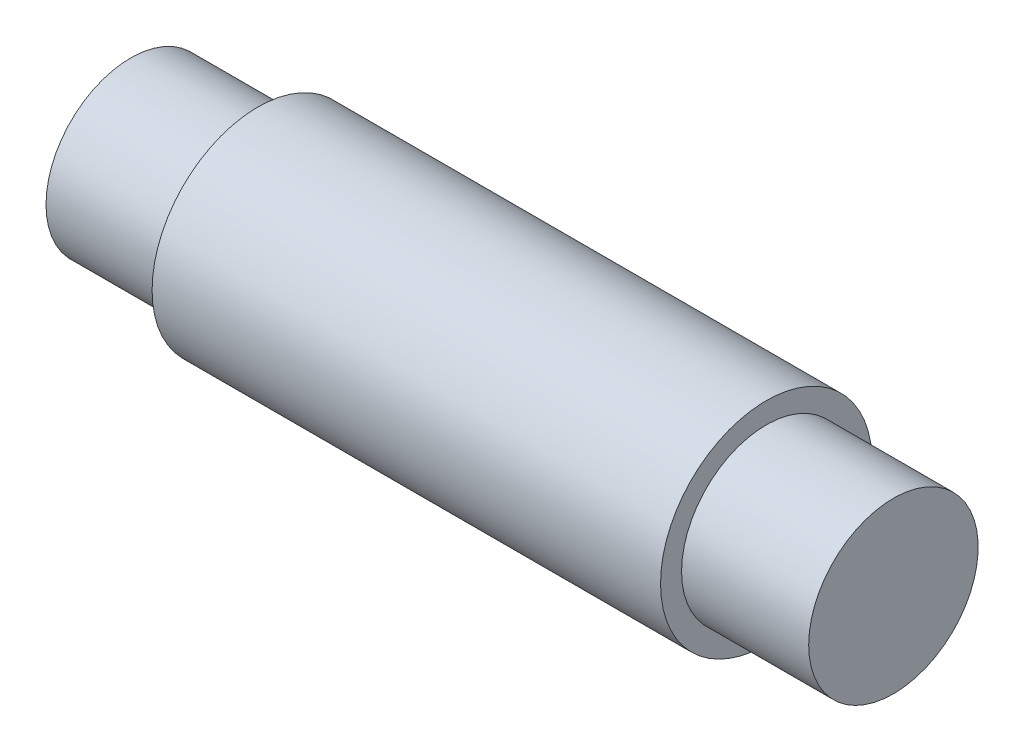
ISO-10303-21;
HEADER;
FILE_DESCRIPTION(('STEP AP214'),'2;1');
FILE_NAME('part.step','',(''),(''),'','','');
FILE_SCHEMA(('AUTOMOTIVE_DESIGN { 1 0 10303 214 1 1 1 1 }'));
ENDSEC;
DATA;
#1=APPLICATION_CONTEXT('core data for automotive mechanical design processes');
#2=APPLICATION_PROTOCOL_DEFINITION('international standard','automotive_design',2000,#1);
#3=PRODUCT_CONTEXT('',#1,'mechanical');
#4=PRODUCT('Part','Part','',(#3));
#5=PRODUCT_RELATED_PRODUCT_CATEGORY('part','',(#4));
#6=PRODUCT_DEFINITION_FORMATION('','',#4);
#7=PRODUCT_DEFINITION_CONTEXT('part definition',#1,'design');
#8=PRODUCT_DEFINITION('design','',#6,#7);
#9=PRODUCT_DEFINITION_SHAPE('','',#8);
#10=(LENGTH_UNIT() NAMED_UNIT(*) SI_UNIT(.MILLI.,.METRE.));
#11=(NAMED_UNIT(*) PLANE_ANGLE_UNIT() SI_UNIT($,.RADIAN.));
#12=(NAMED_UNIT(*) SI_UNIT($,.STERADIAN.) SOLID_ANGLE_UNIT());
#13=UNCERTAINTY_MEASURE_WITH_UNIT(LENGTH_MEASURE(1.E-05),#10,'distance_accuracy_value','');
#14=(GEOMETRIC_REPRESENTATION_CONTEXT(3) GLOBAL_UNCERTAINTY_ASSIGNED_CONTEXT((#13)) GLOBAL_UNIT_ASSIGNED_CONTEXT((#10,
#11,#12)) REPRESENTATION_CONTEXT('',''));
#15=CARTESIAN_POINT('',(0.,0.,0.));
#16=DIRECTION('',(0.,0.,1.));
#17=DIRECTION('',(1.,0.,0.));
#18=AXIS2_PLACEMENT_3D('',#15,#16,#17);
#19=CARTESIAN_POINT('',(0.,3.175,0.));
#20=DIRECTION('',(1.,0.,0.));
#21=DIRECTION('',(0.,0.,-1.));
#22=AXIS2_PLACEMENT_3D('',#19,#20,#21);
#23=PLANE('',#22);
#24=CARTESIAN_POINT('',(0.,0.,0.));
#25=DIRECTION('',(-1.,0.,0.));
#26=DIRECTION('',(0.,0.,1.));
#27=AXIS2_PLACEMENT_3D('',#24,#25,#26);
#28=CIRCLE('',#27,3.175);
#29=CARTESIAN_POINT('',(0.,0.,3.175));
#30=VERTEX_POINT('',#29);
#31=EDGE_CURVE('E53',#30,#30,#28,.T.);
#32=ORIENTED_EDGE('',*,*,#31,.T.);
#33=EDGE_LOOP('',(#32));
#34=FACE_BOUND('',#33,.T.);
#35=ADVANCED_FACE('F31',(#34),#23,.F.);
#36=CARTESIAN_POINT('',(28.575,0.,0.));
#37=DIRECTION('',(-1.,0.,0.));
#38=DIRECTION('',(0.,0.,1.));
#39=AXIS2_PLACEMENT_3D('',#36,#37,#38);
#40=PLANE('',#39);
#41=CARTESIAN_POINT('',(28.575,0.,0.));
#42=DIRECTION('',(-1.,0.,0.));
#43=DIRECTION('',(0.,0.,1.));
#44=AXIS2_PLACEMENT_3D('',#41,#42,#43);
#45=CIRCLE('',#44,3.175);
#46=CARTESIAN_POINT('',(28.575,0.,3.175));
#47=VERTEX_POINT('',#46);
#48=EDGE_CURVE('E10',#47,#47,#45,.T.);
#49=ORIENTED_EDGE('',*,*,#48,.F.);
#50=EDGE_LOOP('',(#49));
#51=FACE_BOUND('',#50,.T.);
#52=ADVANCED_FACE('F83',(#51),#40,.F.);
#53=CARTESIAN_POINT('',(0.,0.,0.));
#54=DIRECTION('',(-1.,0.,0.));
#55=DIRECTION('',(0.,0.,1.));
#56=AXIS2_PLACEMENT_3D('',#53,#54,#55);
#57=CYLINDRICAL_SURFACE('',#56,3.175);
#58=CARTESIAN_POINT('',(23.8125,0.,0.));
#59=DIRECTION('',(-1.,0.,0.));
#60=DIRECTION('',(0.,0.,1.));
#61=AXIS2_PLACEMENT_3D('',#58,#59,#60);
#62=CIRCLE('',#61,3.175);
#63=CARTESIAN_POINT('',(23.8125,0.,3.175));
#64=VERTEX_POINT('',#63);
#65=EDGE_CURVE('E37',#64,#64,#62,.T.);
#66=ORIENTED_EDGE('',*,*,#65,.F.);
#67=EDGE_LOOP('',(#66));
#68=FACE_BOUND('',#67,.T.);
#69=ORIENTED_EDGE('',*,*,#48,.T.);
#70=EDGE_LOOP('',(#69));
#71=FACE_BOUND('',#70,.T.);
#72=ADVANCED_FACE('F78',(#68,#71),#57,.T.);
#73=CARTESIAN_POINT('',(23.8125,3.175,0.));
#74=DIRECTION('',(-1.,0.,0.));
#75=DIRECTION('',(0.,0.,1.));
#76=AXIS2_PLACEMENT_3D('',#73,#74,#75);
#77=PLANE('',#76);
#78=CARTESIAN_POINT('',(23.8125,0.,0.));
#79=DIRECTION('',(-1.,0.,0.));
#80=DIRECTION('',(0.,0.,1.));
#81=AXIS2_PLACEMENT_3D('',#78,#79,#80);
#82=CIRCLE('',#81,3.9624);
#83=CARTESIAN_POINT('',(23.8125,0.,3.9624));
#84=VERTEX_POINT('',#83);
#85=EDGE_CURVE('E41',#84,#84,#82,.T.);
#86=ORIENTED_EDGE('',*,*,#85,.F.);
#87=EDGE_LOOP('',(#86));
#88=FACE_BOUND('',#87,.T.);
#89=ORIENTED_EDGE('',*,*,#65,.T.);
#90=EDGE_LOOP('',(#89));
#91=FACE_BOUND('',#90,.T.);
#92=ADVANCED_FACE('F73',(#88,#91),#77,.F.);
#93=CARTESIAN_POINT('',(0.,0.,0.));
#94=DIRECTION('',(-1.,0.,0.));
#95=DIRECTION('',(0.,0.,1.));
#96=AXIS2_PLACEMENT_3D('',#93,#94,#95);
#97=CYLINDRICAL_SURFACE('',#96,3.9624);
#98=CARTESIAN_POINT('',(4.7625,0.,0.));
#99=DIRECTION('',(-1.,0.,0.));
#100=DIRECTION('',(0.,0.,1.));
#101=AXIS2_PLACEMENT_3D('',#98,#99,#100);
#102=CIRCLE('',#101,3.9624);
#103=CARTESIAN_POINT('',(4.7625,0.,3.9624));
#104=VERTEX_POINT('',#103);
#105=EDGE_CURVE('E45',#104,#104,#102,.T.);
#106=ORIENTED_EDGE('',*,*,#105,.F.);
#107=EDGE_LOOP('',(#106));
#108=FACE_BOUND('',#107,.T.);
#109=ORIENTED_EDGE('',*,*,#85,.T.);
#110=EDGE_LOOP('',(#109));
#111=FACE_BOUND('',#110,.T.);
#112=ADVANCED_FACE('F67',(#108,#111),#97,.T.);
#113=CARTESIAN_POINT('',(4.7625,3.9624,0.));
#114=DIRECTION('',(1.,0.,0.));
#115=DIRECTION('',(0.,0.,-1.));
#116=AXIS2_PLACEMENT_3D('',#113,#114,#115);
#117=PLANE('',#116);
#118=CARTESIAN_POINT('',(4.7625,0.,0.));
#119=DIRECTION('',(-1.,0.,0.));
#120=DIRECTION('',(0.,0.,1.));
#121=AXIS2_PLACEMENT_3D('',#118,#119,#120);
#122=CIRCLE('',#121,3.175);
#123=CARTESIAN_POINT('',(4.7625,0.,3.175));
#124=VERTEX_POINT('',#123);
#125=EDGE_CURVE('E50',#124,#124,#122,.T.);
#126=ORIENTED_EDGE('',*,*,#125,.F.);
#127=EDGE_LOOP('',(#126));
#128=FACE_BOUND('',#127,.T.);
#129=ORIENTED_EDGE('',*,*,#105,.T.);
#130=EDGE_LOOP('',(#129));
#131=FACE_BOUND('',#130,.T.);
#132=ADVANCED_FACE('F61',(#128,#131),#117,.F.);
#133=CARTESIAN_POINT('',(0.,0.,0.));
#134=DIRECTION('',(-1.,0.,0.));
#135=DIRECTION('',(0.,0.,1.));
#136=AXIS2_PLACEMENT_3D('',#133,#134,#135);
#137=CYLINDRICAL_SURFACE('',#136,3.175);
#138=ORIENTED_EDGE('',*,*,#31,.F.);
#139=EDGE_LOOP('',(#138));
#140=FACE_BOUND('',#139,.T.);
#141=ORIENTED_EDGE('',*,*,#125,.T.);
#142=EDGE_LOOP('',(#141));
#143=FACE_BOUND('',#142,.T.);
#144=ADVANCED_FACE('F58',(#140,#143),#137,.T.);
#145=CLOSED_SHELL('',(#35,#52,#72,#92,#112,#132,#144));
#146=MANIFOLD_SOLID_BREP('B2',#145);
#147=ADVANCED_BREP_SHAPE_REPRESENTATION('',(#18,#146),#14);
#148=SHAPE_DEFINITION_REPRESENTATION(#9,#147);
ENDSEC;
END-ISO-10303-21;
